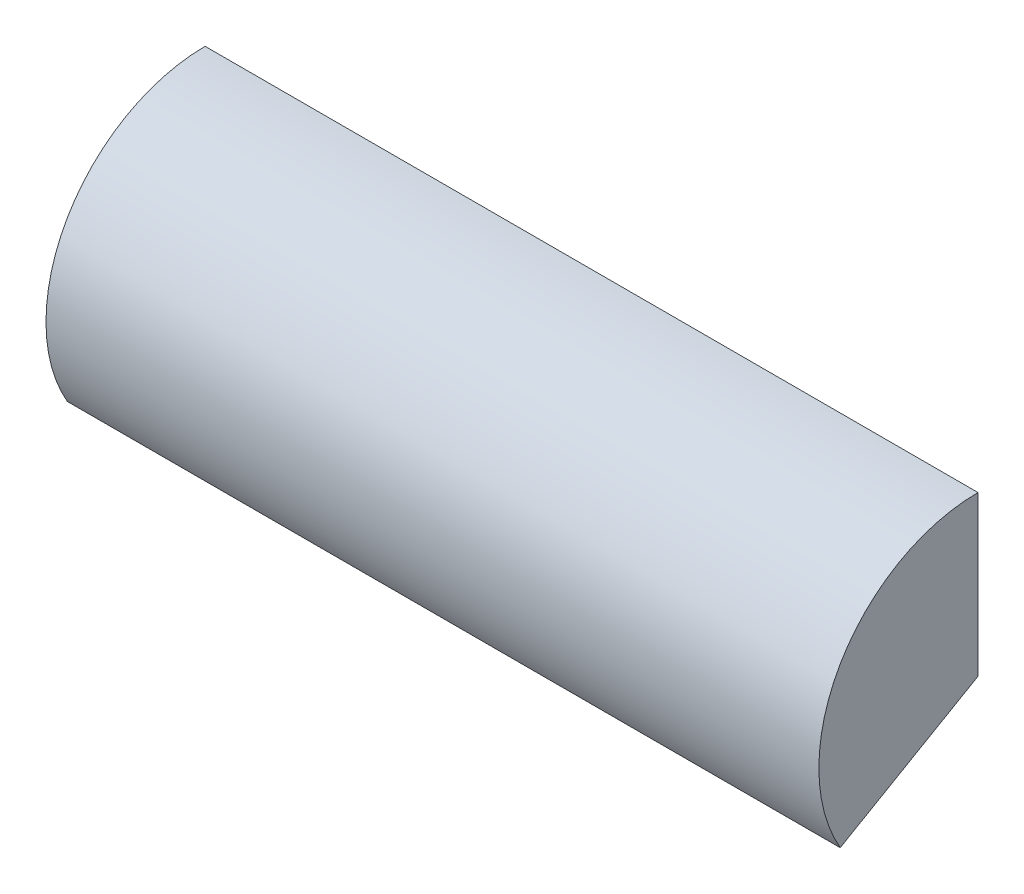
ISO-10303-21;
HEADER;
FILE_DESCRIPTION(('STEP AP214'),'2;1');
FILE_NAME('part.step','',(''),(''),'','','');
FILE_SCHEMA(('AUTOMOTIVE_DESIGN { 1 0 10303 214 1 1 1 1 }'));
ENDSEC;
DATA;
#1=APPLICATION_CONTEXT('core data for automotive mechanical design processes');
#2=APPLICATION_PROTOCOL_DEFINITION('international standard','automotive_design',2000,#1);
#3=PRODUCT_CONTEXT('',#1,'mechanical');
#4=PRODUCT('Part','Part','',(#3));
#5=PRODUCT_RELATED_PRODUCT_CATEGORY('part','',(#4));
#6=PRODUCT_DEFINITION_FORMATION('','',#4);
#7=PRODUCT_DEFINITION_CONTEXT('part definition',#1,'design');
#8=PRODUCT_DEFINITION('design','',#6,#7);
#9=PRODUCT_DEFINITION_SHAPE('','',#8);
#10=(LENGTH_UNIT() NAMED_UNIT(*) SI_UNIT(.MILLI.,.METRE.));
#11=(NAMED_UNIT(*) PLANE_ANGLE_UNIT() SI_UNIT($,.RADIAN.));
#12=(NAMED_UNIT(*) SI_UNIT($,.STERADIAN.) SOLID_ANGLE_UNIT());
#13=UNCERTAINTY_MEASURE_WITH_UNIT(LENGTH_MEASURE(1.E-05),#10,'distance_accuracy_value','');
#14=(GEOMETRIC_REPRESENTATION_CONTEXT(3) GLOBAL_UNCERTAINTY_ASSIGNED_CONTEXT((#13)) GLOBAL_UNIT_ASSIGNED_CONTEXT((#10,
#11,#12)) REPRESENTATION_CONTEXT('',''));
#15=CARTESIAN_POINT('',(0.,0.,0.));
#16=DIRECTION('',(0.,0.,1.));
#17=DIRECTION('',(1.,0.,0.));
#18=AXIS2_PLACEMENT_3D('',#15,#16,#17);
#19=CARTESIAN_POINT('',(0.,0.,0.));
#20=DIRECTION('',(0.,0.866025403784436,0.500000000000004));
#21=DIRECTION('',(-1.,0.,0.));
#22=AXIS2_PLACEMENT_3D('',#19,#20,#21);
#23=PLANE('',#22);
#24=CARTESIAN_POINT('',(-3.81000000000001,0.,0.));
#25=CARTESIAN_POINT('',(-3.40913633911136,-5.71456579877115,9.89791830666695));
#26=CARTESIAN_POINT('',(-63.8098135814434,-11.2502485158449,19.4860020272196));
#27=B_SPLINE_CURVE_WITH_KNOTS('',2,(#24,#25,#26),.UNSPECIFIED.,.F.,.F.,(3,3),(0.,1.),.UNSPECIFIED.);
#28=CARTESIAN_POINT('',(-3.81000000000001,0.,0.));
#29=VERTEX_POINT('',#28);
#30=CARTESIAN_POINT('',(-63.8098135814434,-11.2502485158449,19.4860020272196));
#31=VERTEX_POINT('',#30);
#32=EDGE_CURVE('E110',#29,#31,#27,.T.);
#33=ORIENTED_EDGE('',*,*,#32,.F.);
#34=DIRECTION('',(1.,0.,0.));
#35=VECTOR('',#34,1.);
#36=CARTESIAN_POINT('',(0.,0.,0.));
#37=LINE('',#36,#35);
#38=CARTESIAN_POINT('',(0.,0.,0.));
#39=VERTEX_POINT('',#38);
#40=EDGE_CURVE('E116',#29,#39,#37,.T.);
#41=ORIENTED_EDGE('',*,*,#40,.T.);
#42=DIRECTION('',(0.,-0.500000000000004,0.866025403784436));
#43=VECTOR('',#42,1.);
#44=CARTESIAN_POINT('',(0.,0.,0.));
#45=LINE('',#44,#43);
#46=CARTESIAN_POINT('',(0.,-22.2250000000002,38.4948291982182));
#47=VERTEX_POINT('',#46);
#48=EDGE_CURVE('E127',#39,#47,#45,.T.);
#49=ORIENTED_EDGE('',*,*,#48,.T.);
#50=DIRECTION('',(-1.,0.,0.));
#51=VECTOR('',#50,1.);
#52=CARTESIAN_POINT('',(0.,-22.2250000000002,38.4948291982182));
#53=LINE('',#52,#51);
#54=CARTESIAN_POINT('',(-215.9,-22.2250000000002,38.4948291982182));
#55=VERTEX_POINT('',#54);
#56=EDGE_CURVE('E137',#47,#55,#53,.T.);
#57=ORIENTED_EDGE('',*,*,#56,.T.);
#58=DIRECTION('',(0.,0.500000000000004,-0.866025403784436));
#59=VECTOR('',#58,1.);
#60=CARTESIAN_POINT('',(-215.9,0.,0.));
#61=LINE('',#60,#59);
#62=CARTESIAN_POINT('',(-215.9,0.,0.));
#63=VERTEX_POINT('',#62);
#64=EDGE_CURVE('E139',#55,#63,#61,.T.);
#65=ORIENTED_EDGE('',*,*,#64,.T.);
#66=CARTESIAN_POINT('',(-193.361475910502,0.,0.));
#67=VERTEX_POINT('',#66);
#68=EDGE_CURVE('E126',#63,#67,#37,.T.);
#69=ORIENTED_EDGE('',*,*,#68,.T.);
#70=DIRECTION('',(5.34827480581529E-05,0.499999999284903,-0.866025402545845));
#71=VECTOR('',#70,1.);
#72=CARTESIAN_POINT('',(-193.361475910502,0.,0.));
#73=LINE('',#72,#71);
#74=CARTESIAN_POINT('',(-193.361555592432,-0.744931147842566,1.29025859620391));
#75=VERTEX_POINT('',#74);
#76=EDGE_CURVE('E122',#75,#67,#73,.T.);
#77=ORIENTED_EDGE('',*,*,#76,.F.);
#78=DIRECTION('',(0.985021246387462,-0.0862165067798686,0.149331370193837));
#79=VECTOR('',#78,1.);
#80=CARTESIAN_POINT('',(-201.872373707509,0.,0.));
#81=LINE('',#80,#79);
#82=CARTESIAN_POINT('',(-73.362678959047,-11.24814008753,19.482350122254));
#83=VERTEX_POINT('',#82);
#84=EDGE_CURVE('E171',#75,#83,#81,.T.);
#85=ORIENTED_EDGE('',*,*,#84,.T.);
#86=DIRECTION('',(0.999995922482,-0.00142784972724397,0.0024731082731599));
#87=VECTOR('',#86,1.);
#88=CARTESIAN_POINT('',(-7951.00835022121,0.,0.));
#89=LINE('',#88,#87);
#90=CARTESIAN_POINT('',(-71.8626791829534,-11.2502818705343,19.4860597992363));
#91=VERTEX_POINT('',#90);
#92=EDGE_CURVE('E173',#91,#83,#89,.F.);
#93=ORIENTED_EDGE('',*,*,#92,.F.);
#94=DIRECTION('',(0.999999999965689,4.14196523757703E-06,-7.17409423466744E-06));
#95=VECTOR('',#94,1.);
#96=CARTESIAN_POINT('',(-71.8626791829534,-11.2502818705343,19.4860597992363));
#97=LINE('',#96,#95);
#98=EDGE_CURVE('E118',#91,#31,#97,.T.);
#99=ORIENTED_EDGE('',*,*,#98,.T.);
#100=EDGE_LOOP('',(#33,#41,#49,#57,#65,#69,#77,#85,#93,#99));
#101=FACE_BOUND('',#100,.T.);
#102=ADVANCED_FACE('F36',(#101),#23,.F.);
#103=CARTESIAN_POINT('',(0.,0.,0.));
#104=DIRECTION('',(0.,0.,-1.));
#105=DIRECTION('',(-1.,0.,0.));
#106=AXIS2_PLACEMENT_3D('',#103,#104,#105);
#107=PLANE('',#106);
#108=ORIENTED_EDGE('',*,*,#40,.F.);
#109=CARTESIAN_POINT('',(-3.81000000000001,0.,0.));
#110=CARTESIAN_POINT('',(-3.40913633911136,11.4291315975422,0.));
#111=CARTESIAN_POINT('',(-63.8098135814434,22.5004970316897,0.));
#112=B_SPLINE_CURVE_WITH_KNOTS('',2,(#109,#110,#111),.UNSPECIFIED.,.F.,.F.,(3,3),(0.,1.),.UNSPECIFIED.);
#113=CARTESIAN_POINT('',(-63.8098135814434,22.5004970316897,0.));
#114=VERTEX_POINT('',#113);
#115=EDGE_CURVE('E11',#29,#114,#112,.T.);
#116=ORIENTED_EDGE('',*,*,#115,.T.);
#117=DIRECTION('',(0.999999999965688,-8.283930475154E-06,0.));
#118=VECTOR('',#117,1.);
#119=CARTESIAN_POINT('',(-71.8626791829534,22.5005637410685,0.));
#120=LINE('',#119,#118);
#121=CARTESIAN_POINT('',(-71.8626791829534,22.5005637410685,0.));
#122=VERTEX_POINT('',#121);
#123=EDGE_CURVE('E143',#122,#114,#120,.T.);
#124=ORIENTED_EDGE('',*,*,#123,.F.);
#125=DIRECTION('',(0.999995922482,0.00285569945448792,0.));
#126=VECTOR('',#125,1.);
#127=CARTESIAN_POINT('',(-7951.00835022121,0.,0.));
#128=LINE('',#127,#126);
#129=CARTESIAN_POINT('',(-73.362678959047,22.4962801750598,0.));
#130=VERTEX_POINT('',#129);
#131=EDGE_CURVE('E146',#122,#130,#128,.F.);
#132=ORIENTED_EDGE('',*,*,#131,.T.);
#133=DIRECTION('',(0.985021246387461,0.172433013559736,0.));
#134=VECTOR('',#133,1.);
#135=CARTESIAN_POINT('',(-201.872373707509,0.,0.));
#136=LINE('',#135,#134);
#137=CARTESIAN_POINT('',(-193.361555592432,1.48986229568512,0.));
#138=VERTEX_POINT('',#137);
#139=EDGE_CURVE('E147',#138,#130,#136,.T.);
#140=ORIENTED_EDGE('',*,*,#139,.F.);
#141=DIRECTION('',(5.34827480581528E-05,-0.999999998569798,0.));
#142=VECTOR('',#141,1.);
#143=CARTESIAN_POINT('',(-193.361475910502,0.,0.));
#144=LINE('',#143,#142);
#145=EDGE_CURVE('E48',#138,#67,#144,.T.);
#146=ORIENTED_EDGE('',*,*,#145,.T.);
#147=ORIENTED_EDGE('',*,*,#68,.F.);
#148=DIRECTION('',(0.,-1.,0.));
#149=VECTOR('',#148,1.);
#150=CARTESIAN_POINT('',(-215.9,0.,0.));
#151=LINE('',#150,#149);
#152=CARTESIAN_POINT('',(-215.9,44.45,0.));
#153=VERTEX_POINT('',#152);
#154=EDGE_CURVE('E65',#153,#63,#151,.T.);
#155=ORIENTED_EDGE('',*,*,#154,.F.);
#156=DIRECTION('',(-1.,0.,0.));
#157=VECTOR('',#156,1.);
#158=CARTESIAN_POINT('',(0.,44.45,0.));
#159=LINE('',#158,#157);
#160=CARTESIAN_POINT('',(0.,44.45,0.));
#161=VERTEX_POINT('',#160);
#162=EDGE_CURVE('E131',#161,#153,#159,.T.);
#163=ORIENTED_EDGE('',*,*,#162,.F.);
#164=DIRECTION('',(0.,1.,0.));
#165=VECTOR('',#164,1.);
#166=CARTESIAN_POINT('',(0.,0.,0.));
#167=LINE('',#166,#165);
#168=EDGE_CURVE('E119',#39,#161,#167,.T.);
#169=ORIENTED_EDGE('',*,*,#168,.F.);
#170=EDGE_LOOP('',(#108,#116,#124,#132,#140,#146,#147,#155,#163,#169));
#171=FACE_BOUND('',#170,.T.);
#172=ADVANCED_FACE('F124',(#171),#107,.T.);
#173=CARTESIAN_POINT('',(-215.9,0.,0.));
#174=DIRECTION('',(1.,0.,0.));
#175=DIRECTION('',(0.,0.,-1.));
#176=AXIS2_PLACEMENT_3D('',#173,#174,#175);
#177=PLANE('',#176);
#178=CARTESIAN_POINT('',(-215.9,0.,0.));
#179=DIRECTION('',(-1.,0.,0.));
#180=DIRECTION('',(0.,0.,1.));
#181=AXIS2_PLACEMENT_3D('',#178,#179,#180);
#182=CIRCLE('',#181,44.45);
#183=EDGE_CURVE('E141',#55,#153,#182,.T.);
#184=ORIENTED_EDGE('',*,*,#183,.T.);
#185=ORIENTED_EDGE('',*,*,#154,.T.);
#186=ORIENTED_EDGE('',*,*,#64,.F.);
#187=EDGE_LOOP('',(#184,#185,#186));
#188=FACE_BOUND('',#187,.T.);
#189=ADVANCED_FACE('F37',(#188),#177,.F.);
#190=CARTESIAN_POINT('',(0.,0.,0.));
#191=DIRECTION('',(-1.,0.,0.));
#192=DIRECTION('',(0.,0.,1.));
#193=AXIS2_PLACEMENT_3D('',#190,#191,#192);
#194=CYLINDRICAL_SURFACE('',#193,44.45);
#195=CARTESIAN_POINT('',(0.,0.,0.));
#196=DIRECTION('',(-1.,0.,0.));
#197=DIRECTION('',(0.,0.,1.));
#198=AXIS2_PLACEMENT_3D('',#195,#196,#197);
#199=CIRCLE('',#198,44.45);
#200=EDGE_CURVE('E142',#47,#161,#199,.T.);
#201=ORIENTED_EDGE('',*,*,#200,.T.);
#202=ORIENTED_EDGE('',*,*,#162,.T.);
#203=ORIENTED_EDGE('',*,*,#183,.F.);
#204=ORIENTED_EDGE('',*,*,#56,.F.);
#205=EDGE_LOOP('',(#201,#202,#203,#204));
#206=FACE_BOUND('',#205,.T.);
#207=ADVANCED_FACE('F162',(#206),#194,.T.);
#208=CARTESIAN_POINT('',(0.,0.,0.));
#209=DIRECTION('',(-1.,0.,0.));
#210=DIRECTION('',(0.,0.,1.));
#211=AXIS2_PLACEMENT_3D('',#208,#209,#210);
#212=PLANE('',#211);
#213=ORIENTED_EDGE('',*,*,#48,.F.);
#214=ORIENTED_EDGE('',*,*,#168,.T.);
#215=ORIENTED_EDGE('',*,*,#200,.F.);
#216=EDGE_LOOP('',(#213,#214,#215));
#217=FACE_BOUND('',#216,.T.);
#218=ADVANCED_FACE('F193',(#217),#212,.F.);
#219=CARTESIAN_POINT('',(-3.81000000000001,0.,0.));
#220=CARTESIAN_POINT('',(-3.40913633911136,11.4291315975422,0.));
#221=CARTESIAN_POINT('',(-63.8098135814434,22.5004970316897,0.));
#222=B_SPLINE_CURVE_WITH_KNOTS('',2,(#219,#220,#221),.UNSPECIFIED.,.F.,.F.,(3,3),(0.,1.),.UNSPECIFIED.);
#223=CARTESIAN_POINT('',(-215.9,0.,0.));
#224=DIRECTION('',(-1.,0.,0.));
#225=AXIS1_PLACEMENT('',#223,#224);
#226=SURFACE_OF_REVOLUTION('',#222,#225);
#227=ORIENTED_EDGE('',*,*,#32,.T.);
#228=CARTESIAN_POINT('',(-63.8098135814434,0.,0.));
#229=DIRECTION('',(-1.,0.,0.));
#230=DIRECTION('',(0.,0.,1.));
#231=AXIS2_PLACEMENT_3D('',#228,#229,#230);
#232=CIRCLE('',#231,22.5004970316897);
#233=EDGE_CURVE('E107',#31,#114,#232,.T.);
#234=ORIENTED_EDGE('',*,*,#233,.T.);
#235=ORIENTED_EDGE('',*,*,#115,.F.);
#236=EDGE_LOOP('',(#227,#234,#235));
#237=FACE_BOUND('',#236,.T.);
#238=ADVANCED_FACE('F106',(#237),#226,.F.);
#239=CARTESIAN_POINT('',(-193.361555592432,0.,0.));
#240=DIRECTION('',(-1.,0.,0.));
#241=DIRECTION('',(0.,0.,1.));
#242=AXIS2_PLACEMENT_3D('',#239,#240,#241);
#243=CONICAL_SURFACE('',#242,1.48986229568512,1.57074284404681);
#244=ORIENTED_EDGE('',*,*,#76,.T.);
#245=ORIENTED_EDGE('',*,*,#145,.F.);
#246=CARTESIAN_POINT('',(-193.361555592432,0.,0.));
#247=DIRECTION('',(-1.,0.,0.));
#248=DIRECTION('',(0.,0.,1.));
#249=AXIS2_PLACEMENT_3D('',#246,#247,#248);
#250=CIRCLE('',#249,1.48986229568512);
#251=EDGE_CURVE('E176',#75,#138,#250,.T.);
#252=ORIENTED_EDGE('',*,*,#251,.F.);
#253=EDGE_LOOP('',(#244,#245,#252));
#254=FACE_BOUND('',#253,.T.);
#255=ADVANCED_FACE('F195',(#254),#243,.T.);
#256=CARTESIAN_POINT('',(-193.361555592432,0.,0.));
#257=DIRECTION('',(1.,0.,0.));
#258=DIRECTION('',(0.,0.,-1.));
#259=AXIS2_PLACEMENT_3D('',#256,#257,#258);
#260=CONICAL_SURFACE('',#259,1.48986229568512,0.173299149116919);
#261=ORIENTED_EDGE('',*,*,#251,.T.);
#262=ORIENTED_EDGE('',*,*,#139,.T.);
#263=CARTESIAN_POINT('',(-73.362678959047,0.,0.));
#264=DIRECTION('',(-1.,0.,0.));
#265=DIRECTION('',(0.,0.,1.));
#266=AXIS2_PLACEMENT_3D('',#263,#264,#265);
#267=CIRCLE('',#266,22.4962801750598);
#268=EDGE_CURVE('E178',#83,#130,#267,.T.);
#269=ORIENTED_EDGE('',*,*,#268,.F.);
#270=ORIENTED_EDGE('',*,*,#84,.F.);
#271=EDGE_LOOP('',(#261,#262,#269,#270));
#272=FACE_BOUND('',#271,.T.);
#273=ADVANCED_FACE('F242',(#272),#260,.F.);
#274=CARTESIAN_POINT('',(-71.8626791829534,0.,0.));
#275=DIRECTION('',(1.,0.,0.));
#276=DIRECTION('',(0.,0.,-1.));
#277=AXIS2_PLACEMENT_3D('',#274,#275,#276);
#278=CONICAL_SURFACE('',#277,22.5005637410685,0.00285570333588289);
#279=ORIENTED_EDGE('',*,*,#92,.T.);
#280=ORIENTED_EDGE('',*,*,#268,.T.);
#281=ORIENTED_EDGE('',*,*,#131,.F.);
#282=CARTESIAN_POINT('',(-71.8626791829534,0.,0.));
#283=DIRECTION('',(-1.,0.,0.));
#284=DIRECTION('',(0.,0.,1.));
#285=AXIS2_PLACEMENT_3D('',#282,#283,#284);
#286=CIRCLE('',#285,22.5005637410685);
#287=EDGE_CURVE('E54',#91,#122,#286,.T.);
#288=ORIENTED_EDGE('',*,*,#287,.F.);
#289=EDGE_LOOP('',(#279,#280,#281,#288));
#290=FACE_BOUND('',#289,.T.);
#291=ADVANCED_FACE('F255',(#290),#278,.F.);
#292=CARTESIAN_POINT('',(-71.8626791829534,0.,0.));
#293=DIRECTION('',(-1.,0.,0.));
#294=DIRECTION('',(0.,0.,1.));
#295=AXIS2_PLACEMENT_3D('',#292,#293,#294);
#296=CONICAL_SURFACE('',#295,22.5005637410685,8.28393047524874E-06);
#297=ORIENTED_EDGE('',*,*,#287,.T.);
#298=ORIENTED_EDGE('',*,*,#123,.T.);
#299=ORIENTED_EDGE('',*,*,#233,.F.);
#300=ORIENTED_EDGE('',*,*,#98,.F.);
#301=EDGE_LOOP('',(#297,#298,#299,#300));
#302=FACE_BOUND('',#301,.T.);
#303=ADVANCED_FACE('F261',(#302),#296,.F.);
#304=CLOSED_SHELL('',(#102,#172,#189,#207,#218,#238,#255,#273,#291,#303));
#305=MANIFOLD_SOLID_BREP('B2',#304);
#306=ADVANCED_BREP_SHAPE_REPRESENTATION('',(#18,#305),#14);
#307=SHAPE_DEFINITION_REPRESENTATION(#9,#306);
ENDSEC;
END-ISO-10303-21;
